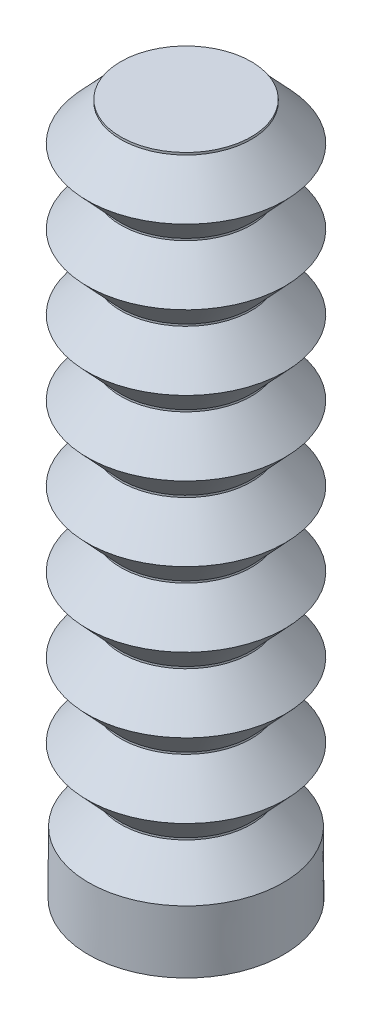
ISO-10303-21;
HEADER;
FILE_DESCRIPTION(('STEP AP214'),'2;1');
FILE_NAME('part.step','',(''),(''),'','','');
FILE_SCHEMA(('AUTOMOTIVE_DESIGN { 1 0 10303 214 1 1 1 1 }'));
ENDSEC;
DATA;
#1=APPLICATION_CONTEXT('core data for automotive mechanical design processes');
#2=APPLICATION_PROTOCOL_DEFINITION('international standard','automotive_design',2000,#1);
#3=PRODUCT_CONTEXT('',#1,'mechanical');
#4=PRODUCT('Part','Part','',(#3));
#5=PRODUCT_RELATED_PRODUCT_CATEGORY('part','',(#4));
#6=PRODUCT_DEFINITION_FORMATION('','',#4);
#7=PRODUCT_DEFINITION_CONTEXT('part definition',#1,'design');
#8=PRODUCT_DEFINITION('design','',#6,#7);
#9=PRODUCT_DEFINITION_SHAPE('','',#8);
#10=(LENGTH_UNIT() NAMED_UNIT(*) SI_UNIT(.MILLI.,.METRE.));
#11=(NAMED_UNIT(*) PLANE_ANGLE_UNIT() SI_UNIT($,.RADIAN.));
#12=(NAMED_UNIT(*) SI_UNIT($,.STERADIAN.) SOLID_ANGLE_UNIT());
#13=UNCERTAINTY_MEASURE_WITH_UNIT(LENGTH_MEASURE(1.E-05),#10,'distance_accuracy_value','');
#14=(GEOMETRIC_REPRESENTATION_CONTEXT(3) GLOBAL_UNCERTAINTY_ASSIGNED_CONTEXT((#13)) GLOBAL_UNIT_ASSIGNED_CONTEXT((#10,
#11,#12)) REPRESENTATION_CONTEXT('',''));
#15=CARTESIAN_POINT('',(0.,0.,0.));
#16=DIRECTION('',(0.,0.,1.));
#17=DIRECTION('',(1.,0.,0.));
#18=AXIS2_PLACEMENT_3D('',#15,#16,#17);
#19=CARTESIAN_POINT('',(-5.43163068128709,34.1029540037317,0.));
#20=DIRECTION('',(0.,1.,0.));
#21=DIRECTION('',(-1.,0.,0.));
#22=AXIS2_PLACEMENT_3D('',#19,#20,#21);
#23=CYLINDRICAL_SURFACE('',#22,3.3);
#24=CARTESIAN_POINT('',(-5.43163068128709,30.3384095308826,0.));
#25=DIRECTION('',(0.,1.,0.));
#26=DIRECTION('',(-1.,0.,0.));
#27=AXIS2_PLACEMENT_3D('',#24,#25,#26);
#28=CIRCLE('',#27,3.3);
#29=CARTESIAN_POINT('',(-8.73163068128709,30.3384095308826,0.));
#30=VERTEX_POINT('',#29);
#31=EDGE_CURVE('E10',#30,#30,#28,.T.);
#32=ORIENTED_EDGE('',*,*,#31,.F.);
#33=EDGE_LOOP('',(#32));
#34=FACE_BOUND('',#33,.T.);
#35=CARTESIAN_POINT('',(-5.43163068128709,30.2384095308826,0.));
#36=DIRECTION('',(0.,1.,0.));
#37=DIRECTION('',(-1.,0.,0.));
#38=AXIS2_PLACEMENT_3D('',#35,#36,#37);
#39=CIRCLE('',#38,3.3);
#40=CARTESIAN_POINT('',(-8.73163068128709,30.2384095308826,0.));
#41=VERTEX_POINT('',#40);
#42=EDGE_CURVE('E121',#41,#41,#39,.T.);
#43=ORIENTED_EDGE('',*,*,#42,.T.);
#44=EDGE_LOOP('',(#43));
#45=FACE_BOUND('',#44,.T.);
#46=ADVANCED_FACE('F33',(#34,#45),#23,.T.);
#47=CARTESIAN_POINT('',(-5.43163068128709,30.3384095308826,0.));
#48=DIRECTION('',(0.,1.,0.));
#49=DIRECTION('',(-1.,0.,0.));
#50=AXIS2_PLACEMENT_3D('',#47,#48,#49);
#51=CONICAL_SURFACE('',#50,3.3,0.749952023138734);
#52=CARTESIAN_POINT('',(-5.43163068128709,32.1634095308826,0.));
#53=DIRECTION('',(0.,1.,0.));
#54=DIRECTION('',(-1.,0.,0.));
#55=AXIS2_PLACEMENT_3D('',#52,#53,#54);
#56=CIRCLE('',#55,5.);
#57=CARTESIAN_POINT('',(-10.4316306812871,32.1634095308826,0.));
#58=VERTEX_POINT('',#57);
#59=EDGE_CURVE('E39',#58,#58,#56,.T.);
#60=ORIENTED_EDGE('',*,*,#59,.F.);
#61=EDGE_LOOP('',(#60));
#62=FACE_BOUND('',#61,.T.);
#63=ORIENTED_EDGE('',*,*,#31,.T.);
#64=EDGE_LOOP('',(#63));
#65=FACE_BOUND('',#64,.T.);
#66=ADVANCED_FACE('F275',(#62,#65),#51,.T.);
#67=CARTESIAN_POINT('',(-5.43163068128709,32.1634095308826,0.));
#68=DIRECTION('',(0.,-1.,0.));
#69=DIRECTION('',(1.,0.,0.));
#70=AXIS2_PLACEMENT_3D('',#67,#68,#69);
#71=CONICAL_SURFACE('',#70,5.,0.749952023138734);
#72=CARTESIAN_POINT('',(-5.43163068128709,33.9884095308826,0.));
#73=DIRECTION('',(0.,1.,0.));
#74=DIRECTION('',(-1.,0.,0.));
#75=AXIS2_PLACEMENT_3D('',#72,#73,#74);
#76=CIRCLE('',#75,3.3);
#77=CARTESIAN_POINT('',(-8.73163068128709,33.9884095308826,0.));
#78=VERTEX_POINT('',#77);
#79=EDGE_CURVE('E43',#78,#78,#76,.T.);
#80=ORIENTED_EDGE('',*,*,#79,.F.);
#81=EDGE_LOOP('',(#80));
#82=FACE_BOUND('',#81,.T.);
#83=ORIENTED_EDGE('',*,*,#59,.T.);
#84=EDGE_LOOP('',(#83));
#85=FACE_BOUND('',#84,.T.);
#86=ADVANCED_FACE('F280',(#82,#85),#71,.T.);
#87=CARTESIAN_POINT('',(-5.43163068128709,34.1029540037317,0.));
#88=DIRECTION('',(0.,1.,0.));
#89=DIRECTION('',(-1.,0.,0.));
#90=AXIS2_PLACEMENT_3D('',#87,#88,#89);
#91=CYLINDRICAL_SURFACE('',#90,3.3);
#92=CARTESIAN_POINT('',(-5.43163068128709,34.1029540037317,0.));
#93=DIRECTION('',(0.,1.,0.));
#94=DIRECTION('',(-1.,0.,0.));
#95=AXIS2_PLACEMENT_3D('',#92,#93,#94);
#96=CIRCLE('',#95,3.3);
#97=CARTESIAN_POINT('',(-8.73163068128709,34.1029540037317,0.));
#98=VERTEX_POINT('',#97);
#99=EDGE_CURVE('E47',#98,#98,#96,.T.);
#100=ORIENTED_EDGE('',*,*,#99,.F.);
#101=EDGE_LOOP('',(#100));
#102=FACE_BOUND('',#101,.T.);
#103=ORIENTED_EDGE('',*,*,#79,.T.);
#104=EDGE_LOOP('',(#103));
#105=FACE_BOUND('',#104,.T.);
#106=ADVANCED_FACE('F271',(#102,#105),#91,.T.);
#107=CARTESIAN_POINT('',(-2.13163068128709,34.1029540037317,0.));
#108=DIRECTION('',(0.,-1.,0.));
#109=DIRECTION('',(1.,0.,0.));
#110=AXIS2_PLACEMENT_3D('',#107,#108,#109);
#111=PLANE('',#110);
#112=ORIENTED_EDGE('',*,*,#99,.T.);
#113=EDGE_LOOP('',(#112));
#114=FACE_BOUND('',#113,.T.);
#115=ADVANCED_FACE('F266',(#114),#111,.F.);
#116=CARTESIAN_POINT('',(-5.43163068128709,-0.900000000000158,0.));
#117=DIRECTION('',(0.,1.,0.));
#118=DIRECTION('',(-1.,0.,0.));
#119=AXIS2_PLACEMENT_3D('',#116,#117,#118);
#120=PLANE('',#119);
#121=CARTESIAN_POINT('',(-5.43163068128709,-0.900000000000158,0.));
#122=DIRECTION('',(0.,1.,0.));
#123=DIRECTION('',(-1.,0.,0.));
#124=AXIS2_PLACEMENT_3D('',#121,#122,#123);
#125=CIRCLE('',#124,4.9365081526756);
#126=CARTESIAN_POINT('',(-10.3681388339627,-0.900000000000158,0.));
#127=VERTEX_POINT('',#126);
#128=EDGE_CURVE('E52',#127,#127,#125,.T.);
#129=ORIENTED_EDGE('',*,*,#128,.F.);
#130=EDGE_LOOP('',(#129));
#131=FACE_BOUND('',#130,.T.);
#132=ADVANCED_FACE('F261',(#131),#120,.F.);
#133=CARTESIAN_POINT('',(-5.43163068128709,-0.900000000000158,0.));
#134=DIRECTION('',(0.,-1.,0.));
#135=DIRECTION('',(1.,0.,0.));
#136=AXIS2_PLACEMENT_3D('',#133,#134,#135);
#137=CONICAL_SURFACE('',#136,4.9365081526756,0.00570625388925542);
#138=CARTESIAN_POINT('',(-5.43163068128709,2.24550168514075,0.));
#139=DIRECTION('',(0.,1.,0.));
#140=DIRECTION('',(-1.,0.,0.));
#141=AXIS2_PLACEMENT_3D('',#138,#139,#140);
#142=CIRCLE('',#141,4.91855892663377);
#143=CARTESIAN_POINT('',(-10.3501896079209,2.24550168514075,0.));
#144=VERTEX_POINT('',#143);
#145=EDGE_CURVE('E55',#144,#144,#142,.T.);
#146=ORIENTED_EDGE('',*,*,#145,.F.);
#147=EDGE_LOOP('',(#146));
#148=FACE_BOUND('',#147,.T.);
#149=ORIENTED_EDGE('',*,*,#128,.T.);
#150=EDGE_LOOP('',(#149));
#151=FACE_BOUND('',#150,.T.);
#152=ADVANCED_FACE('F255',(#148,#151),#137,.T.);
#153=CARTESIAN_POINT('',(-5.43163068128709,2.24550168514075,0.));
#154=DIRECTION('',(0.,-1.,0.));
#155=DIRECTION('',(1.,0.,0.));
#156=AXIS2_PLACEMENT_3D('',#153,#154,#155);
#157=CONICAL_SURFACE('',#156,4.91855892663377,0.74842256535505);
#158=CARTESIAN_POINT('',(-5.43163068128709,3.98840953088229,0.));
#159=DIRECTION('',(0.,1.,0.));
#160=DIRECTION('',(-1.,0.,0.));
#161=AXIS2_PLACEMENT_3D('',#158,#159,#160);
#162=CIRCLE('',#161,3.30000000000031);
#163=CARTESIAN_POINT('',(-8.7316306812874,3.98840953088229,0.));
#164=VERTEX_POINT('',#163);
#165=EDGE_CURVE('E58',#164,#164,#162,.T.);
#166=ORIENTED_EDGE('',*,*,#165,.F.);
#167=EDGE_LOOP('',(#166));
#168=FACE_BOUND('',#167,.T.);
#169=ORIENTED_EDGE('',*,*,#145,.T.);
#170=EDGE_LOOP('',(#169));
#171=FACE_BOUND('',#170,.T.);
#172=ADVANCED_FACE('F249',(#168,#171),#157,.T.);
#173=CARTESIAN_POINT('',(-5.43163068128709,34.1029540037317,0.));
#174=DIRECTION('',(0.,1.,0.));
#175=DIRECTION('',(-1.,0.,0.));
#176=AXIS2_PLACEMENT_3D('',#173,#174,#175);
#177=CYLINDRICAL_SURFACE('',#176,3.30000000000029);
#178=CARTESIAN_POINT('',(-5.43163068128709,4.08840953088234,0.));
#179=DIRECTION('',(0.,1.,0.));
#180=DIRECTION('',(-1.,0.,0.));
#181=AXIS2_PLACEMENT_3D('',#178,#179,#180);
#182=CIRCLE('',#181,3.30000000000027);
#183=CARTESIAN_POINT('',(-8.73163068128736,4.08840953088234,0.));
#184=VERTEX_POINT('',#183);
#185=EDGE_CURVE('E61',#184,#184,#182,.T.);
#186=ORIENTED_EDGE('',*,*,#185,.F.);
#187=EDGE_LOOP('',(#186));
#188=FACE_BOUND('',#187,.T.);
#189=ORIENTED_EDGE('',*,*,#165,.T.);
#190=EDGE_LOOP('',(#189));
#191=FACE_BOUND('',#190,.T.);
#192=ADVANCED_FACE('F243',(#188,#191),#177,.T.);
#193=CARTESIAN_POINT('',(-5.43163068128709,4.08840953088234,0.));
#194=DIRECTION('',(0.,1.,0.));
#195=DIRECTION('',(-1.,0.,0.));
#196=AXIS2_PLACEMENT_3D('',#193,#194,#195);
#197=CONICAL_SURFACE('',#196,3.30000000000027,0.749952023138733);
#198=CARTESIAN_POINT('',(-5.43163068128709,5.91340953088234,0.));
#199=DIRECTION('',(0.,1.,0.));
#200=DIRECTION('',(-1.,0.,0.));
#201=AXIS2_PLACEMENT_3D('',#198,#199,#200);
#202=CIRCLE('',#201,5.00000000000027);
#203=CARTESIAN_POINT('',(-10.4316306812874,5.91340953088234,0.));
#204=VERTEX_POINT('',#203);
#205=EDGE_CURVE('E64',#204,#204,#202,.T.);
#206=ORIENTED_EDGE('',*,*,#205,.F.);
#207=EDGE_LOOP('',(#206));
#208=FACE_BOUND('',#207,.T.);
#209=ORIENTED_EDGE('',*,*,#185,.T.);
#210=EDGE_LOOP('',(#209));
#211=FACE_BOUND('',#210,.T.);
#212=ADVANCED_FACE('F237',(#208,#211),#197,.T.);
#213=CARTESIAN_POINT('',(-5.43163068128709,5.91340953088234,0.));
#214=DIRECTION('',(0.,-1.,0.));
#215=DIRECTION('',(1.,0.,0.));
#216=AXIS2_PLACEMENT_3D('',#213,#214,#215);
#217=CONICAL_SURFACE('',#216,5.00000000000027,0.749952023138734);
#218=CARTESIAN_POINT('',(-5.43163068128709,7.73840953088234,0.));
#219=DIRECTION('',(0.,1.,0.));
#220=DIRECTION('',(-1.,0.,0.));
#221=AXIS2_PLACEMENT_3D('',#218,#219,#220);
#222=CIRCLE('',#221,3.30000000000027);
#223=CARTESIAN_POINT('',(-8.73163068128736,7.73840953088234,0.));
#224=VERTEX_POINT('',#223);
#225=EDGE_CURVE('E67',#224,#224,#222,.T.);
#226=ORIENTED_EDGE('',*,*,#225,.F.);
#227=EDGE_LOOP('',(#226));
#228=FACE_BOUND('',#227,.T.);
#229=ORIENTED_EDGE('',*,*,#205,.T.);
#230=EDGE_LOOP('',(#229));
#231=FACE_BOUND('',#230,.T.);
#232=ADVANCED_FACE('F231',(#228,#231),#217,.T.);
#233=CARTESIAN_POINT('',(-5.43163068128709,34.1029540037317,0.));
#234=DIRECTION('',(0.,1.,0.));
#235=DIRECTION('',(-1.,0.,0.));
#236=AXIS2_PLACEMENT_3D('',#233,#234,#235);
#237=CYLINDRICAL_SURFACE('',#236,3.30000000000025);
#238=CARTESIAN_POINT('',(-5.43163068128709,7.83840953088238,0.));
#239=DIRECTION('',(0.,1.,0.));
#240=DIRECTION('',(-1.,0.,0.));
#241=AXIS2_PLACEMENT_3D('',#238,#239,#240);
#242=CIRCLE('',#241,3.30000000000023);
#243=CARTESIAN_POINT('',(-8.73163068128732,7.83840953088238,0.));
#244=VERTEX_POINT('',#243);
#245=EDGE_CURVE('E70',#244,#244,#242,.T.);
#246=ORIENTED_EDGE('',*,*,#245,.F.);
#247=EDGE_LOOP('',(#246));
#248=FACE_BOUND('',#247,.T.);
#249=ORIENTED_EDGE('',*,*,#225,.T.);
#250=EDGE_LOOP('',(#249));
#251=FACE_BOUND('',#250,.T.);
#252=ADVANCED_FACE('F225',(#248,#251),#237,.T.);
#253=CARTESIAN_POINT('',(-5.43163068128709,7.83840953088238,0.));
#254=DIRECTION('',(0.,1.,0.));
#255=DIRECTION('',(-1.,0.,0.));
#256=AXIS2_PLACEMENT_3D('',#253,#254,#255);
#257=CONICAL_SURFACE('',#256,3.30000000000023,0.749952023138734);
#258=CARTESIAN_POINT('',(-5.43163068128709,9.66340953088238,0.));
#259=DIRECTION('',(0.,1.,0.));
#260=DIRECTION('',(-1.,0.,0.));
#261=AXIS2_PLACEMENT_3D('',#258,#259,#260);
#262=CIRCLE('',#261,5.00000000000023);
#263=CARTESIAN_POINT('',(-10.4316306812873,9.66340953088238,0.));
#264=VERTEX_POINT('',#263);
#265=EDGE_CURVE('E73',#264,#264,#262,.T.);
#266=ORIENTED_EDGE('',*,*,#265,.F.);
#267=EDGE_LOOP('',(#266));
#268=FACE_BOUND('',#267,.T.);
#269=ORIENTED_EDGE('',*,*,#245,.T.);
#270=EDGE_LOOP('',(#269));
#271=FACE_BOUND('',#270,.T.);
#272=ADVANCED_FACE('F219',(#268,#271),#257,.T.);
#273=CARTESIAN_POINT('',(-5.43163068128709,9.66340953088238,0.));
#274=DIRECTION('',(0.,-1.,0.));
#275=DIRECTION('',(1.,0.,0.));
#276=AXIS2_PLACEMENT_3D('',#273,#274,#275);
#277=CONICAL_SURFACE('',#276,5.00000000000023,0.749952023138734);
#278=CARTESIAN_POINT('',(-5.43163068128709,11.4884095308824,0.));
#279=DIRECTION('',(0.,1.,0.));
#280=DIRECTION('',(-1.,0.,0.));
#281=AXIS2_PLACEMENT_3D('',#278,#279,#280);
#282=CIRCLE('',#281,3.30000000000023);
#283=CARTESIAN_POINT('',(-8.73163068128732,11.4884095308824,0.));
#284=VERTEX_POINT('',#283);
#285=EDGE_CURVE('E76',#284,#284,#282,.T.);
#286=ORIENTED_EDGE('',*,*,#285,.F.);
#287=EDGE_LOOP('',(#286));
#288=FACE_BOUND('',#287,.T.);
#289=ORIENTED_EDGE('',*,*,#265,.T.);
#290=EDGE_LOOP('',(#289));
#291=FACE_BOUND('',#290,.T.);
#292=ADVANCED_FACE('F213',(#288,#291),#277,.T.);
#293=CARTESIAN_POINT('',(-5.43163068128709,34.1029540037317,0.));
#294=DIRECTION('',(0.,1.,0.));
#295=DIRECTION('',(-1.,0.,0.));
#296=AXIS2_PLACEMENT_3D('',#293,#294,#295);
#297=CYLINDRICAL_SURFACE('',#296,3.30000000000021);
#298=CARTESIAN_POINT('',(-5.43163068128709,11.5884095308824,0.));
#299=DIRECTION('',(0.,1.,0.));
#300=DIRECTION('',(-1.,0.,0.));
#301=AXIS2_PLACEMENT_3D('',#298,#299,#300);
#302=CIRCLE('',#301,3.30000000000019);
#303=CARTESIAN_POINT('',(-8.73163068128729,11.5884095308824,0.));
#304=VERTEX_POINT('',#303);
#305=EDGE_CURVE('E79',#304,#304,#302,.T.);
#306=ORIENTED_EDGE('',*,*,#305,.F.);
#307=EDGE_LOOP('',(#306));
#308=FACE_BOUND('',#307,.T.);
#309=ORIENTED_EDGE('',*,*,#285,.T.);
#310=EDGE_LOOP('',(#309));
#311=FACE_BOUND('',#310,.T.);
#312=ADVANCED_FACE('F207',(#308,#311),#297,.T.);
#313=CARTESIAN_POINT('',(-5.43163068128709,11.5884095308824,0.));
#314=DIRECTION('',(0.,1.,0.));
#315=DIRECTION('',(-1.,0.,0.));
#316=AXIS2_PLACEMENT_3D('',#313,#314,#315);
#317=CONICAL_SURFACE('',#316,3.30000000000019,0.749952023138734);
#318=CARTESIAN_POINT('',(-5.43163068128709,13.4134095308824,0.));
#319=DIRECTION('',(0.,1.,0.));
#320=DIRECTION('',(-1.,0.,0.));
#321=AXIS2_PLACEMENT_3D('',#318,#319,#320);
#322=CIRCLE('',#321,5.00000000000019);
#323=CARTESIAN_POINT('',(-10.4316306812873,13.4134095308824,0.));
#324=VERTEX_POINT('',#323);
#325=EDGE_CURVE('E82',#324,#324,#322,.T.);
#326=ORIENTED_EDGE('',*,*,#325,.F.);
#327=EDGE_LOOP('',(#326));
#328=FACE_BOUND('',#327,.T.);
#329=ORIENTED_EDGE('',*,*,#305,.T.);
#330=EDGE_LOOP('',(#329));
#331=FACE_BOUND('',#330,.T.);
#332=ADVANCED_FACE('F201',(#328,#331),#317,.T.);
#333=CARTESIAN_POINT('',(-5.43163068128709,13.4134095308824,0.));
#334=DIRECTION('',(0.,-1.,0.));
#335=DIRECTION('',(1.,0.,0.));
#336=AXIS2_PLACEMENT_3D('',#333,#334,#335);
#337=CONICAL_SURFACE('',#336,5.00000000000019,0.749952023138734);
#338=CARTESIAN_POINT('',(-5.43163068128709,15.2384095308824,0.));
#339=DIRECTION('',(0.,1.,0.));
#340=DIRECTION('',(-1.,0.,0.));
#341=AXIS2_PLACEMENT_3D('',#338,#339,#340);
#342=CIRCLE('',#341,3.30000000000019);
#343=CARTESIAN_POINT('',(-8.73163068128729,15.2384095308824,0.));
#344=VERTEX_POINT('',#343);
#345=EDGE_CURVE('E85',#344,#344,#342,.T.);
#346=ORIENTED_EDGE('',*,*,#345,.F.);
#347=EDGE_LOOP('',(#346));
#348=FACE_BOUND('',#347,.T.);
#349=ORIENTED_EDGE('',*,*,#325,.T.);
#350=EDGE_LOOP('',(#349));
#351=FACE_BOUND('',#350,.T.);
#352=ADVANCED_FACE('F195',(#348,#351),#337,.T.);
#353=CARTESIAN_POINT('',(-5.43163068128709,34.1029540037317,0.));
#354=DIRECTION('',(0.,1.,0.));
#355=DIRECTION('',(-1.,0.,0.));
#356=AXIS2_PLACEMENT_3D('',#353,#354,#355);
#357=CYLINDRICAL_SURFACE('',#356,3.30000000000017);
#358=CARTESIAN_POINT('',(-5.43163068128709,15.3384095308825,0.));
#359=DIRECTION('',(0.,1.,0.));
#360=DIRECTION('',(-1.,0.,0.));
#361=AXIS2_PLACEMENT_3D('',#358,#359,#360);
#362=CIRCLE('',#361,3.30000000000016);
#363=CARTESIAN_POINT('',(-8.73163068128725,15.3384095308825,0.));
#364=VERTEX_POINT('',#363);
#365=EDGE_CURVE('E88',#364,#364,#362,.T.);
#366=ORIENTED_EDGE('',*,*,#365,.F.);
#367=EDGE_LOOP('',(#366));
#368=FACE_BOUND('',#367,.T.);
#369=ORIENTED_EDGE('',*,*,#345,.T.);
#370=EDGE_LOOP('',(#369));
#371=FACE_BOUND('',#370,.T.);
#372=ADVANCED_FACE('F189',(#368,#371),#357,.T.);
#373=CARTESIAN_POINT('',(-5.43163068128709,15.3384095308825,0.));
#374=DIRECTION('',(0.,1.,0.));
#375=DIRECTION('',(-1.,0.,0.));
#376=AXIS2_PLACEMENT_3D('',#373,#374,#375);
#377=CONICAL_SURFACE('',#376,3.30000000000015,0.749952023138734);
#378=CARTESIAN_POINT('',(-5.43163068128709,17.1634095308825,0.));
#379=DIRECTION('',(0.,1.,0.));
#380=DIRECTION('',(-1.,0.,0.));
#381=AXIS2_PLACEMENT_3D('',#378,#379,#380);
#382=CIRCLE('',#381,5.00000000000016);
#383=CARTESIAN_POINT('',(-10.4316306812872,17.1634095308825,0.));
#384=VERTEX_POINT('',#383);
#385=EDGE_CURVE('E91',#384,#384,#382,.T.);
#386=ORIENTED_EDGE('',*,*,#385,.F.);
#387=EDGE_LOOP('',(#386));
#388=FACE_BOUND('',#387,.T.);
#389=ORIENTED_EDGE('',*,*,#365,.T.);
#390=EDGE_LOOP('',(#389));
#391=FACE_BOUND('',#390,.T.);
#392=ADVANCED_FACE('F183',(#388,#391),#377,.T.);
#393=CARTESIAN_POINT('',(-5.43163068128709,17.1634095308825,0.));
#394=DIRECTION('',(0.,-1.,0.));
#395=DIRECTION('',(1.,0.,0.));
#396=AXIS2_PLACEMENT_3D('',#393,#394,#395);
#397=CONICAL_SURFACE('',#396,5.00000000000016,0.749952023138734);
#398=CARTESIAN_POINT('',(-5.43163068128709,18.9884095308825,0.));
#399=DIRECTION('',(0.,1.,0.));
#400=DIRECTION('',(-1.,0.,0.));
#401=AXIS2_PLACEMENT_3D('',#398,#399,#400);
#402=CIRCLE('',#401,3.30000000000016);
#403=CARTESIAN_POINT('',(-8.73163068128725,18.9884095308825,0.));
#404=VERTEX_POINT('',#403);
#405=EDGE_CURVE('E94',#404,#404,#402,.T.);
#406=ORIENTED_EDGE('',*,*,#405,.F.);
#407=EDGE_LOOP('',(#406));
#408=FACE_BOUND('',#407,.T.);
#409=ORIENTED_EDGE('',*,*,#385,.T.);
#410=EDGE_LOOP('',(#409));
#411=FACE_BOUND('',#410,.T.);
#412=ADVANCED_FACE('F177',(#408,#411),#397,.T.);
#413=CARTESIAN_POINT('',(-5.43163068128709,34.1029540037317,0.));
#414=DIRECTION('',(0.,1.,0.));
#415=DIRECTION('',(-1.,0.,0.));
#416=AXIS2_PLACEMENT_3D('',#413,#414,#415);
#417=CYLINDRICAL_SURFACE('',#416,3.30000000000014);
#418=CARTESIAN_POINT('',(-5.43163068128709,19.0884095308825,0.));
#419=DIRECTION('',(0.,1.,0.));
#420=DIRECTION('',(-1.,0.,0.));
#421=AXIS2_PLACEMENT_3D('',#418,#419,#420);
#422=CIRCLE('',#421,3.30000000000012);
#423=CARTESIAN_POINT('',(-8.73163068128721,19.0884095308825,0.));
#424=VERTEX_POINT('',#423);
#425=EDGE_CURVE('E97',#424,#424,#422,.T.);
#426=ORIENTED_EDGE('',*,*,#425,.F.);
#427=EDGE_LOOP('',(#426));
#428=FACE_BOUND('',#427,.T.);
#429=ORIENTED_EDGE('',*,*,#405,.T.);
#430=EDGE_LOOP('',(#429));
#431=FACE_BOUND('',#430,.T.);
#432=ADVANCED_FACE('F171',(#428,#431),#417,.T.);
#433=CARTESIAN_POINT('',(-5.43163068128709,19.0884095308825,0.));
#434=DIRECTION('',(0.,1.,0.));
#435=DIRECTION('',(-1.,0.,0.));
#436=AXIS2_PLACEMENT_3D('',#433,#434,#435);
#437=CONICAL_SURFACE('',#436,3.30000000000012,0.749952023138733);
#438=CARTESIAN_POINT('',(-5.43163068128709,20.9134095308825,0.));
#439=DIRECTION('',(0.,1.,0.));
#440=DIRECTION('',(-1.,0.,0.));
#441=AXIS2_PLACEMENT_3D('',#438,#439,#440);
#442=CIRCLE('',#441,5.00000000000012);
#443=CARTESIAN_POINT('',(-10.4316306812872,20.9134095308825,0.));
#444=VERTEX_POINT('',#443);
#445=EDGE_CURVE('E100',#444,#444,#442,.T.);
#446=ORIENTED_EDGE('',*,*,#445,.F.);
#447=EDGE_LOOP('',(#446));
#448=FACE_BOUND('',#447,.T.);
#449=ORIENTED_EDGE('',*,*,#425,.T.);
#450=EDGE_LOOP('',(#449));
#451=FACE_BOUND('',#450,.T.);
#452=ADVANCED_FACE('F165',(#448,#451),#437,.T.);
#453=CARTESIAN_POINT('',(-5.43163068128709,20.9134095308825,0.));
#454=DIRECTION('',(0.,-1.,0.));
#455=DIRECTION('',(1.,0.,0.));
#456=AXIS2_PLACEMENT_3D('',#453,#454,#455);
#457=CONICAL_SURFACE('',#456,5.00000000000012,0.749952023138734);
#458=CARTESIAN_POINT('',(-5.43163068128709,22.7384095308825,0.));
#459=DIRECTION('',(0.,1.,0.));
#460=DIRECTION('',(-1.,0.,0.));
#461=AXIS2_PLACEMENT_3D('',#458,#459,#460);
#462=CIRCLE('',#461,3.30000000000012);
#463=CARTESIAN_POINT('',(-8.73163068128721,22.7384095308825,0.));
#464=VERTEX_POINT('',#463);
#465=EDGE_CURVE('E103',#464,#464,#462,.T.);
#466=ORIENTED_EDGE('',*,*,#465,.F.);
#467=EDGE_LOOP('',(#466));
#468=FACE_BOUND('',#467,.T.);
#469=ORIENTED_EDGE('',*,*,#445,.T.);
#470=EDGE_LOOP('',(#469));
#471=FACE_BOUND('',#470,.T.);
#472=ADVANCED_FACE('F159',(#468,#471),#457,.T.);
#473=CARTESIAN_POINT('',(-5.43163068128709,34.1029540037317,0.));
#474=DIRECTION('',(0.,1.,0.));
#475=DIRECTION('',(-1.,0.,0.));
#476=AXIS2_PLACEMENT_3D('',#473,#474,#475);
#477=CYLINDRICAL_SURFACE('',#476,3.3000000000001);
#478=CARTESIAN_POINT('',(-5.43163068128709,22.8384095308825,0.));
#479=DIRECTION('',(0.,1.,0.));
#480=DIRECTION('',(-1.,0.,0.));
#481=AXIS2_PLACEMENT_3D('',#478,#479,#480);
#482=CIRCLE('',#481,3.30000000000008);
#483=CARTESIAN_POINT('',(-8.73163068128717,22.8384095308825,0.));
#484=VERTEX_POINT('',#483);
#485=EDGE_CURVE('E106',#484,#484,#482,.T.);
#486=ORIENTED_EDGE('',*,*,#485,.F.);
#487=EDGE_LOOP('',(#486));
#488=FACE_BOUND('',#487,.T.);
#489=ORIENTED_EDGE('',*,*,#465,.T.);
#490=EDGE_LOOP('',(#489));
#491=FACE_BOUND('',#490,.T.);
#492=ADVANCED_FACE('F153',(#488,#491),#477,.T.);
#493=CARTESIAN_POINT('',(-5.43163068128709,22.8384095308825,0.));
#494=DIRECTION('',(0.,1.,0.));
#495=DIRECTION('',(-1.,0.,0.));
#496=AXIS2_PLACEMENT_3D('',#493,#494,#495);
#497=CONICAL_SURFACE('',#496,3.30000000000008,0.749952023138734);
#498=CARTESIAN_POINT('',(-5.43163068128709,24.6634095308825,0.));
#499=DIRECTION('',(0.,1.,0.));
#500=DIRECTION('',(-1.,0.,0.));
#501=AXIS2_PLACEMENT_3D('',#498,#499,#500);
#502=CIRCLE('',#501,5.00000000000008);
#503=CARTESIAN_POINT('',(-10.4316306812872,24.6634095308825,0.));
#504=VERTEX_POINT('',#503);
#505=EDGE_CURVE('E109',#504,#504,#502,.T.);
#506=ORIENTED_EDGE('',*,*,#505,.F.);
#507=EDGE_LOOP('',(#506));
#508=FACE_BOUND('',#507,.T.);
#509=ORIENTED_EDGE('',*,*,#485,.T.);
#510=EDGE_LOOP('',(#509));
#511=FACE_BOUND('',#510,.T.);
#512=ADVANCED_FACE('F147',(#508,#511),#497,.T.);
#513=CARTESIAN_POINT('',(-5.43163068128709,24.6634095308825,0.));
#514=DIRECTION('',(0.,-1.,0.));
#515=DIRECTION('',(1.,0.,0.));
#516=AXIS2_PLACEMENT_3D('',#513,#514,#515);
#517=CONICAL_SURFACE('',#516,5.00000000000008,0.749952023138734);
#518=CARTESIAN_POINT('',(-5.43163068128709,26.4884095308825,0.));
#519=DIRECTION('',(0.,1.,0.));
#520=DIRECTION('',(-1.,0.,0.));
#521=AXIS2_PLACEMENT_3D('',#518,#519,#520);
#522=CIRCLE('',#521,3.30000000000008);
#523=CARTESIAN_POINT('',(-8.73163068128717,26.4884095308825,0.));
#524=VERTEX_POINT('',#523);
#525=EDGE_CURVE('E112',#524,#524,#522,.T.);
#526=ORIENTED_EDGE('',*,*,#525,.F.);
#527=EDGE_LOOP('',(#526));
#528=FACE_BOUND('',#527,.T.);
#529=ORIENTED_EDGE('',*,*,#505,.T.);
#530=EDGE_LOOP('',(#529));
#531=FACE_BOUND('',#530,.T.);
#532=ADVANCED_FACE('F141',(#528,#531),#517,.T.);
#533=CARTESIAN_POINT('',(-5.43163068128709,34.1029540037317,0.));
#534=DIRECTION('',(0.,1.,0.));
#535=DIRECTION('',(-1.,0.,0.));
#536=AXIS2_PLACEMENT_3D('',#533,#534,#535);
#537=CYLINDRICAL_SURFACE('',#536,3.30000000000006);
#538=CARTESIAN_POINT('',(-5.43163068128709,26.5884095308826,0.));
#539=DIRECTION('',(0.,1.,0.));
#540=DIRECTION('',(-1.,0.,0.));
#541=AXIS2_PLACEMENT_3D('',#538,#539,#540);
#542=CIRCLE('',#541,3.30000000000004);
#543=CARTESIAN_POINT('',(-8.73163068128713,26.5884095308826,0.));
#544=VERTEX_POINT('',#543);
#545=EDGE_CURVE('E115',#544,#544,#542,.T.);
#546=ORIENTED_EDGE('',*,*,#545,.F.);
#547=EDGE_LOOP('',(#546));
#548=FACE_BOUND('',#547,.T.);
#549=ORIENTED_EDGE('',*,*,#525,.T.);
#550=EDGE_LOOP('',(#549));
#551=FACE_BOUND('',#550,.T.);
#552=ADVANCED_FACE('F135',(#548,#551),#537,.T.);
#553=CARTESIAN_POINT('',(-5.43163068128709,26.5884095308826,0.));
#554=DIRECTION('',(0.,1.,0.));
#555=DIRECTION('',(-1.,0.,0.));
#556=AXIS2_PLACEMENT_3D('',#553,#554,#555);
#557=CONICAL_SURFACE('',#556,3.30000000000004,0.749952023138734);
#558=CARTESIAN_POINT('',(-5.43163068128709,28.4134095308826,0.));
#559=DIRECTION('',(0.,1.,0.));
#560=DIRECTION('',(-1.,0.,0.));
#561=AXIS2_PLACEMENT_3D('',#558,#559,#560);
#562=CIRCLE('',#561,5.00000000000004);
#563=CARTESIAN_POINT('',(-10.4316306812871,28.4134095308826,0.));
#564=VERTEX_POINT('',#563);
#565=EDGE_CURVE('E118',#564,#564,#562,.T.);
#566=ORIENTED_EDGE('',*,*,#565,.F.);
#567=EDGE_LOOP('',(#566));
#568=FACE_BOUND('',#567,.T.);
#569=ORIENTED_EDGE('',*,*,#545,.T.);
#570=EDGE_LOOP('',(#569));
#571=FACE_BOUND('',#570,.T.);
#572=ADVANCED_FACE('F129',(#568,#571),#557,.T.);
#573=CARTESIAN_POINT('',(-5.43163068128709,28.4134095308826,0.));
#574=DIRECTION('',(0.,-1.,0.));
#575=DIRECTION('',(1.,0.,0.));
#576=AXIS2_PLACEMENT_3D('',#573,#574,#575);
#577=CONICAL_SURFACE('',#576,5.00000000000004,0.749952023138734);
#578=ORIENTED_EDGE('',*,*,#42,.F.);
#579=EDGE_LOOP('',(#578));
#580=FACE_BOUND('',#579,.T.);
#581=ORIENTED_EDGE('',*,*,#565,.T.);
#582=EDGE_LOOP('',(#581));
#583=FACE_BOUND('',#582,.T.);
#584=ADVANCED_FACE('F126',(#580,#583),#577,.T.);
#585=CLOSED_SHELL('',(#46,#66,#86,#106,#115,#132,#152,#172,#192,#212,#232,#252,#272,#292,#312,
#332,#352,#372,#392,#412,#432,#452,#472,#492,#512,#532,#552,#572,#584));
#586=MANIFOLD_SOLID_BREP('B2',#585);
#587=ADVANCED_BREP_SHAPE_REPRESENTATION('',(#18,#586),#14);
#588=SHAPE_DEFINITION_REPRESENTATION(#9,#587);
ENDSEC;
END-ISO-10303-21;
